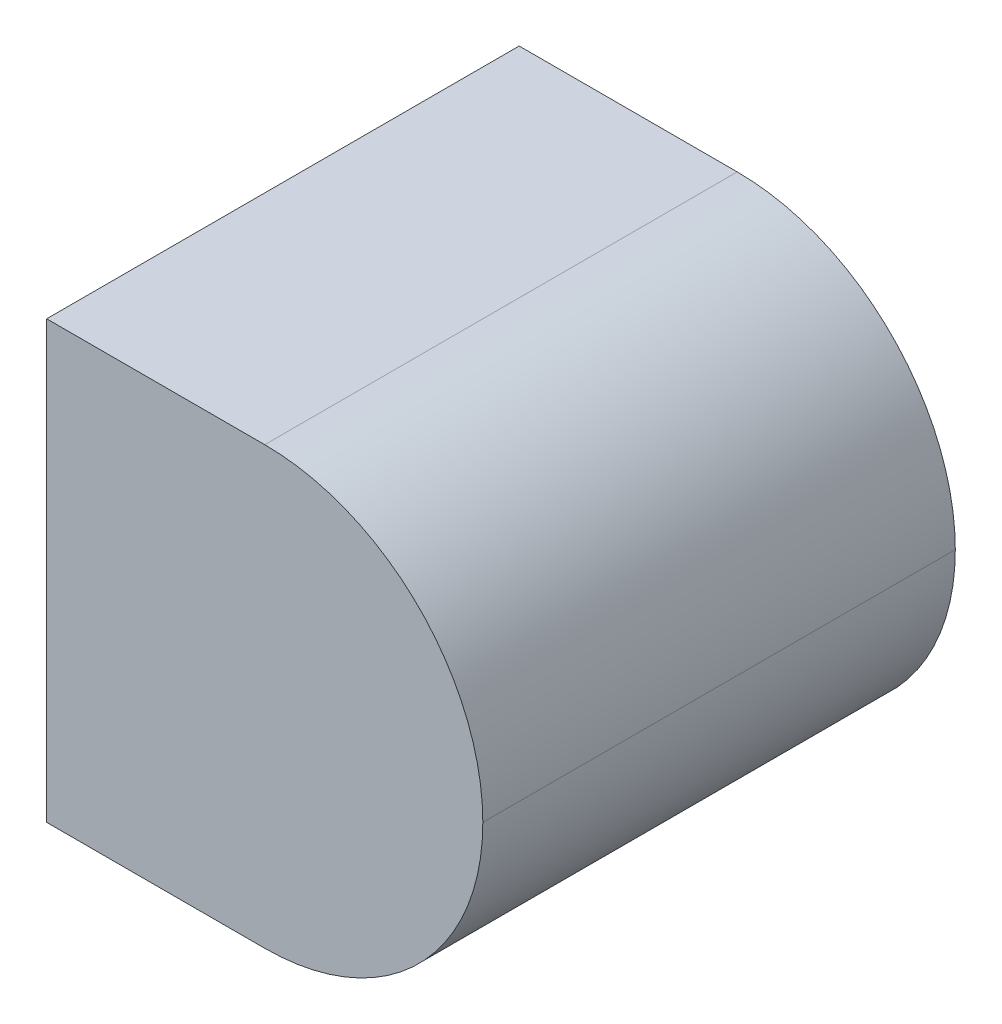
ISO-10303-21;
HEADER;
FILE_DESCRIPTION(('STEP AP214'),'2;1');
FILE_NAME('part.step','',(''),(''),'','','');
FILE_SCHEMA(('AUTOMOTIVE_DESIGN { 1 0 10303 214 1 1 1 1 }'));
ENDSEC;
DATA;
#1=APPLICATION_CONTEXT('core data for automotive mechanical design processes');
#2=APPLICATION_PROTOCOL_DEFINITION('international standard','automotive_design',2000,#1);
#3=PRODUCT_CONTEXT('',#1,'mechanical');
#4=PRODUCT('Part','Part','',(#3));
#5=PRODUCT_RELATED_PRODUCT_CATEGORY('part','',(#4));
#6=PRODUCT_DEFINITION_FORMATION('','',#4);
#7=PRODUCT_DEFINITION_CONTEXT('part definition',#1,'design');
#8=PRODUCT_DEFINITION('design','',#6,#7);
#9=PRODUCT_DEFINITION_SHAPE('','',#8);
#10=(LENGTH_UNIT() NAMED_UNIT(*) SI_UNIT(.MILLI.,.METRE.));
#11=(NAMED_UNIT(*) PLANE_ANGLE_UNIT() SI_UNIT($,.RADIAN.));
#12=(NAMED_UNIT(*) SI_UNIT($,.STERADIAN.) SOLID_ANGLE_UNIT());
#13=UNCERTAINTY_MEASURE_WITH_UNIT(LENGTH_MEASURE(1.E-05),#10,'distance_accuracy_value','');
#14=(GEOMETRIC_REPRESENTATION_CONTEXT(3) GLOBAL_UNCERTAINTY_ASSIGNED_CONTEXT((#13)) GLOBAL_UNIT_ASSIGNED_CONTEXT((#10,
#11,#12)) REPRESENTATION_CONTEXT('',''));
#15=CARTESIAN_POINT('',(0.,0.,0.));
#16=DIRECTION('',(0.,0.,1.));
#17=DIRECTION('',(1.,0.,0.));
#18=AXIS2_PLACEMENT_3D('',#15,#16,#17);
#19=CARTESIAN_POINT('',(-3.,3.,6.5));
#20=DIRECTION('',(1.,0.,0.));
#21=DIRECTION('',(0.,1.,0.));
#22=AXIS2_PLACEMENT_3D('',#19,#20,#21);
#23=PLANE('',#22);
#24=CARTESIAN_POINT('',(-3.,0.,3.25));
#25=DIRECTION('',(-1.,0.,0.));
#26=DIRECTION('',(0.,-1.,0.));
#27=AXIS2_PLACEMENT_3D('',#24,#25,#26);
#28=CIRCLE('',#27,1.6);
#29=CARTESIAN_POINT('',(-3.,-1.6,3.25));
#30=VERTEX_POINT('',#29);
#31=EDGE_CURVE('E128',#30,#30,#28,.T.);
#32=ORIENTED_EDGE('',*,*,#31,.F.);
#33=EDGE_LOOP('',(#32));
#34=FACE_BOUND('',#33,.T.);
#35=DIRECTION('',(0.,-1.,0.));
#36=VECTOR('',#35,1.);
#37=CARTESIAN_POINT('',(-3.,3.,0.));
#38=LINE('',#37,#36);
#39=CARTESIAN_POINT('',(-3.,3.,0.));
#40=VERTEX_POINT('',#39);
#41=CARTESIAN_POINT('',(-3.,-3.,0.));
#42=VERTEX_POINT('',#41);
#43=EDGE_CURVE('E101',#40,#42,#38,.T.);
#44=ORIENTED_EDGE('',*,*,#43,.T.);
#45=DIRECTION('',(0.,0.,-1.));
#46=VECTOR('',#45,1.);
#47=CARTESIAN_POINT('',(-3.,-3.,6.5));
#48=LINE('',#47,#46);
#49=CARTESIAN_POINT('',(-3.,-3.,6.5));
#50=VERTEX_POINT('',#49);
#51=EDGE_CURVE('E86',#50,#42,#48,.T.);
#52=ORIENTED_EDGE('',*,*,#51,.F.);
#53=DIRECTION('',(0.,-1.,0.));
#54=VECTOR('',#53,1.);
#55=CARTESIAN_POINT('',(-3.,3.,6.5));
#56=LINE('',#55,#54);
#57=CARTESIAN_POINT('',(-3.,3.,6.5));
#58=VERTEX_POINT('',#57);
#59=EDGE_CURVE('E91',#58,#50,#56,.T.);
#60=ORIENTED_EDGE('',*,*,#59,.F.);
#61=DIRECTION('',(0.,0.,-1.));
#62=VECTOR('',#61,1.);
#63=CARTESIAN_POINT('',(-3.,3.,6.5));
#64=LINE('',#63,#62);
#65=EDGE_CURVE('E103',#58,#40,#64,.T.);
#66=ORIENTED_EDGE('',*,*,#65,.T.);
#67=EDGE_LOOP('',(#44,#52,#60,#66));
#68=FACE_BOUND('',#67,.T.);
#69=ADVANCED_FACE('F37',(#34,#68),#23,.F.);
#70=CARTESIAN_POINT('',(3.,-3.,6.5));
#71=DIRECTION('',(0.,1.,0.));
#72=DIRECTION('',(-1.,0.,0.));
#73=AXIS2_PLACEMENT_3D('',#70,#71,#72);
#74=PLANE('',#73);
#75=DIRECTION('',(1.,0.,0.));
#76=VECTOR('',#75,1.);
#77=CARTESIAN_POINT('',(3.,-3.,0.));
#78=LINE('',#77,#76);
#79=CARTESIAN_POINT('',(0.,-3.,0.));
#80=VERTEX_POINT('',#79);
#81=EDGE_CURVE('E116',#42,#80,#78,.T.);
#82=ORIENTED_EDGE('',*,*,#81,.T.);
#83=DIRECTION('',(0.,0.,-1.));
#84=VECTOR('',#83,1.);
#85=CARTESIAN_POINT('',(0.,-3.,6.5));
#86=LINE('',#85,#84);
#87=CARTESIAN_POINT('',(0.,-3.,6.5));
#88=VERTEX_POINT('',#87);
#89=EDGE_CURVE('E89',#80,#88,#86,.F.);
#90=ORIENTED_EDGE('',*,*,#89,.T.);
#91=DIRECTION('',(1.,0.,0.));
#92=VECTOR('',#91,1.);
#93=CARTESIAN_POINT('',(3.,-3.,6.5));
#94=LINE('',#93,#92);
#95=EDGE_CURVE('E81',#50,#88,#94,.T.);
#96=ORIENTED_EDGE('',*,*,#95,.F.);
#97=ORIENTED_EDGE('',*,*,#51,.T.);
#98=EDGE_LOOP('',(#82,#90,#96,#97));
#99=FACE_BOUND('',#98,.T.);
#100=ADVANCED_FACE('F84',(#99),#74,.F.);
#101=CARTESIAN_POINT('',(3.,3.,6.5));
#102=DIRECTION('',(0.,-1.,0.));
#103=DIRECTION('',(1.,0.,0.));
#104=AXIS2_PLACEMENT_3D('',#101,#102,#103);
#105=PLANE('',#104);
#106=DIRECTION('',(-1.,0.,0.));
#107=VECTOR('',#106,1.);
#108=CARTESIAN_POINT('',(3.,3.,6.5));
#109=LINE('',#108,#107);
#110=CARTESIAN_POINT('',(0.,3.,6.5));
#111=VERTEX_POINT('',#110);
#112=EDGE_CURVE('E90',#111,#58,#109,.T.);
#113=ORIENTED_EDGE('',*,*,#112,.F.);
#114=DIRECTION('',(0.,0.,-1.));
#115=VECTOR('',#114,1.);
#116=CARTESIAN_POINT('',(0.,3.,6.5));
#117=LINE('',#116,#115);
#118=CARTESIAN_POINT('',(0.,3.,0.));
#119=VERTEX_POINT('',#118);
#120=EDGE_CURVE('E11',#111,#119,#117,.T.);
#121=ORIENTED_EDGE('',*,*,#120,.T.);
#122=DIRECTION('',(-1.,0.,0.));
#123=VECTOR('',#122,1.);
#124=CARTESIAN_POINT('',(3.,3.,0.));
#125=LINE('',#124,#123);
#126=EDGE_CURVE('E98',#119,#40,#125,.T.);
#127=ORIENTED_EDGE('',*,*,#126,.T.);
#128=ORIENTED_EDGE('',*,*,#65,.F.);
#129=EDGE_LOOP('',(#113,#121,#127,#128));
#130=FACE_BOUND('',#129,.T.);
#131=ADVANCED_FACE('F136',(#130),#105,.F.);
#132=CARTESIAN_POINT('',(0.,0.,6.5));
#133=DIRECTION('',(0.,0.,-1.));
#134=DIRECTION('',(-1.,0.,0.));
#135=AXIS2_PLACEMENT_3D('',#132,#133,#134);
#136=PLANE('',#135);
#137=ORIENTED_EDGE('',*,*,#95,.T.);
#138=CARTESIAN_POINT('',(0.,0.,6.5));
#139=DIRECTION('',(0.,0.,-1.));
#140=DIRECTION('',(-1.,0.,0.));
#141=AXIS2_PLACEMENT_3D('',#138,#139,#140);
#142=CIRCLE('',#141,3.);
#143=CARTESIAN_POINT('',(3.,0.,6.5));
#144=VERTEX_POINT('',#143);
#145=EDGE_CURVE('E46',#88,#144,#142,.F.);
#146=ORIENTED_EDGE('',*,*,#145,.T.);
#147=CARTESIAN_POINT('',(0.,0.,6.5));
#148=DIRECTION('',(0.,0.,-1.));
#149=DIRECTION('',(-1.,0.,0.));
#150=AXIS2_PLACEMENT_3D('',#147,#148,#149);
#151=CIRCLE('',#150,3.);
#152=EDGE_CURVE('E53',#144,#111,#151,.F.);
#153=ORIENTED_EDGE('',*,*,#152,.T.);
#154=ORIENTED_EDGE('',*,*,#112,.T.);
#155=ORIENTED_EDGE('',*,*,#59,.T.);
#156=EDGE_LOOP('',(#137,#146,#153,#154,#155));
#157=FACE_BOUND('',#156,.T.);
#158=ADVANCED_FACE('F94',(#157),#136,.F.);
#159=CARTESIAN_POINT('',(0.,0.,0.));
#160=DIRECTION('',(0.,0.,-1.));
#161=DIRECTION('',(-1.,0.,0.));
#162=AXIS2_PLACEMENT_3D('',#159,#160,#161);
#163=PLANE('',#162);
#164=CARTESIAN_POINT('',(0.,0.,0.));
#165=DIRECTION('',(0.,0.,-1.));
#166=DIRECTION('',(-1.,0.,0.));
#167=AXIS2_PLACEMENT_3D('',#164,#165,#166);
#168=CIRCLE('',#167,3.);
#169=CARTESIAN_POINT('',(3.,0.,0.));
#170=VERTEX_POINT('',#169);
#171=EDGE_CURVE('E102',#119,#170,#168,.T.);
#172=ORIENTED_EDGE('',*,*,#171,.T.);
#173=CARTESIAN_POINT('',(0.,0.,0.));
#174=DIRECTION('',(0.,0.,-1.));
#175=DIRECTION('',(-1.,0.,0.));
#176=AXIS2_PLACEMENT_3D('',#173,#174,#175);
#177=CIRCLE('',#176,3.);
#178=EDGE_CURVE('E105',#170,#80,#177,.T.);
#179=ORIENTED_EDGE('',*,*,#178,.T.);
#180=ORIENTED_EDGE('',*,*,#81,.F.);
#181=ORIENTED_EDGE('',*,*,#43,.F.);
#182=ORIENTED_EDGE('',*,*,#126,.F.);
#183=EDGE_LOOP('',(#172,#179,#180,#181,#182));
#184=FACE_BOUND('',#183,.T.);
#185=ADVANCED_FACE('F115',(#184),#163,.T.);
#186=CARTESIAN_POINT('',(0.,0.,6.5));
#187=DIRECTION('',(0.,0.,-1.));
#188=DIRECTION('',(-1.,0.,0.));
#189=AXIS2_PLACEMENT_3D('',#186,#187,#188);
#190=CYLINDRICAL_SURFACE('',#189,3.);
#191=ORIENTED_EDGE('',*,*,#120,.F.);
#192=ORIENTED_EDGE('',*,*,#152,.F.);
#193=DIRECTION('',(0.,0.,-1.));
#194=VECTOR('',#193,1.);
#195=CARTESIAN_POINT('',(3.,0.,6.5));
#196=LINE('',#195,#194);
#197=EDGE_CURVE('E41',#170,#144,#196,.F.);
#198=ORIENTED_EDGE('',*,*,#197,.F.);
#199=ORIENTED_EDGE('',*,*,#171,.F.);
#200=EDGE_LOOP('',(#191,#192,#198,#199));
#201=FACE_BOUND('',#200,.T.);
#202=ADVANCED_FACE('F39',(#201),#190,.T.);
#203=CARTESIAN_POINT('',(0.,0.,6.5));
#204=DIRECTION('',(0.,0.,-1.));
#205=DIRECTION('',(-1.,0.,0.));
#206=AXIS2_PLACEMENT_3D('',#203,#204,#205);
#207=CYLINDRICAL_SURFACE('',#206,3.);
#208=ORIENTED_EDGE('',*,*,#145,.F.);
#209=ORIENTED_EDGE('',*,*,#89,.F.);
#210=ORIENTED_EDGE('',*,*,#178,.F.);
#211=ORIENTED_EDGE('',*,*,#197,.T.);
#212=EDGE_LOOP('',(#208,#209,#210,#211));
#213=FACE_BOUND('',#212,.T.);
#214=ADVANCED_FACE('F123',(#213),#207,.T.);
#215=CARTESIAN_POINT('',(-1.,0.,3.25));
#216=DIRECTION('',(-1.,0.,0.));
#217=DIRECTION('',(0.,-1.,0.));
#218=AXIS2_PLACEMENT_3D('',#215,#216,#217);
#219=CYLINDRICAL_SURFACE('',#218,1.6);
#220=CARTESIAN_POINT('',(-1.,0.,3.25));
#221=DIRECTION('',(-1.,0.,0.));
#222=DIRECTION('',(0.,-1.,0.));
#223=AXIS2_PLACEMENT_3D('',#220,#221,#222);
#224=CIRCLE('',#223,1.6);
#225=CARTESIAN_POINT('',(-1.,-1.6,3.25));
#226=VERTEX_POINT('',#225);
#227=EDGE_CURVE('E125',#226,#226,#224,.T.);
#228=ORIENTED_EDGE('',*,*,#227,.F.);
#229=EDGE_LOOP('',(#228));
#230=FACE_BOUND('',#229,.T.);
#231=ORIENTED_EDGE('',*,*,#31,.T.);
#232=EDGE_LOOP('',(#231));
#233=FACE_BOUND('',#232,.T.);
#234=ADVANCED_FACE('F143',(#230,#233),#219,.F.);
#235=CARTESIAN_POINT('',(-1.,0.,3.25));
#236=DIRECTION('',(-1.,0.,0.));
#237=DIRECTION('',(0.,-1.,0.));
#238=AXIS2_PLACEMENT_3D('',#235,#236,#237);
#239=PLANE('',#238);
#240=ORIENTED_EDGE('',*,*,#227,.T.);
#241=EDGE_LOOP('',(#240));
#242=FACE_BOUND('',#241,.T.);
#243=ADVANCED_FACE('F160',(#242),#239,.T.);
#244=CLOSED_SHELL('',(#69,#100,#131,#158,#185,#202,#214,#234,#243));
#245=MANIFOLD_SOLID_BREP('B2',#244);
#246=ADVANCED_BREP_SHAPE_REPRESENTATION('',(#18,#245),#14);
#247=SHAPE_DEFINITION_REPRESENTATION(#9,#246);
ENDSEC;
END-ISO-10303-21;
